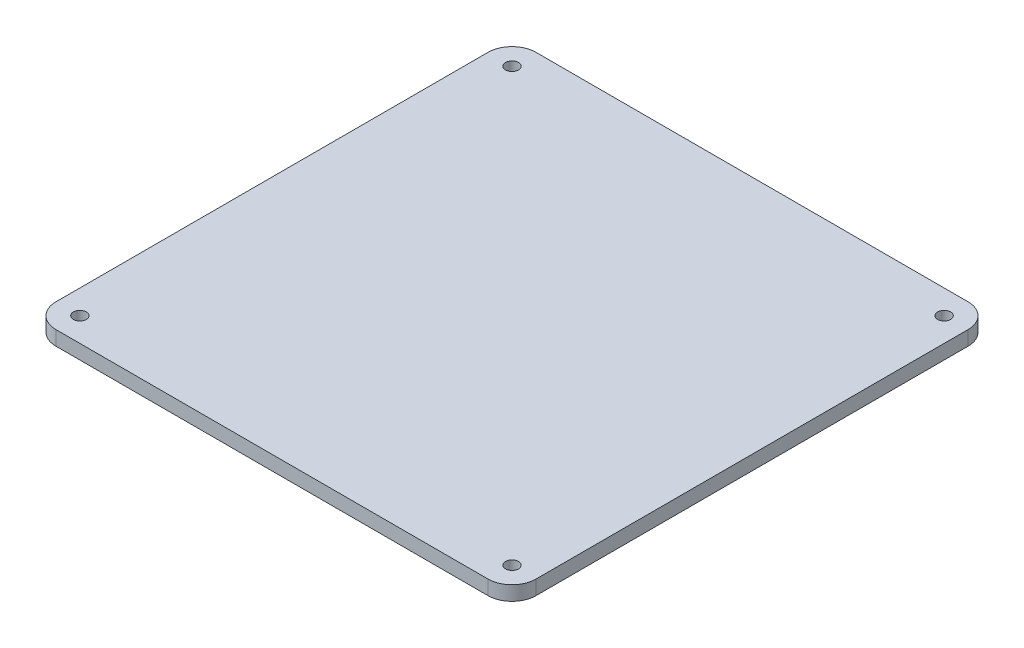
ISO-10303-21;
HEADER;
FILE_DESCRIPTION(('STEP AP214'),'2;1');
FILE_NAME('part.step','',(''),(''),'','','');
FILE_SCHEMA(('AUTOMOTIVE_DESIGN { 1 0 10303 214 1 1 1 1 }'));
ENDSEC;
DATA;
#1=APPLICATION_CONTEXT('core data for automotive mechanical design processes');
#2=APPLICATION_PROTOCOL_DEFINITION('international standard','automotive_design',2000,#1);
#3=PRODUCT_CONTEXT('',#1,'mechanical');
#4=PRODUCT('Part','Part','',(#3));
#5=PRODUCT_RELATED_PRODUCT_CATEGORY('part','',(#4));
#6=PRODUCT_DEFINITION_FORMATION('','',#4);
#7=PRODUCT_DEFINITION_CONTEXT('part definition',#1,'design');
#8=PRODUCT_DEFINITION('design','',#6,#7);
#9=PRODUCT_DEFINITION_SHAPE('','',#8);
#10=(LENGTH_UNIT() NAMED_UNIT(*) SI_UNIT(.MILLI.,.METRE.));
#11=(NAMED_UNIT(*) PLANE_ANGLE_UNIT() SI_UNIT($,.RADIAN.));
#12=(NAMED_UNIT(*) SI_UNIT($,.STERADIAN.) SOLID_ANGLE_UNIT());
#13=UNCERTAINTY_MEASURE_WITH_UNIT(LENGTH_MEASURE(1.E-05),#10,'distance_accuracy_value','');
#14=(GEOMETRIC_REPRESENTATION_CONTEXT(3) GLOBAL_UNCERTAINTY_ASSIGNED_CONTEXT((#13)) GLOBAL_UNIT_ASSIGNED_CONTEXT((#10,
#11,#12)) REPRESENTATION_CONTEXT('',''));
#15=CARTESIAN_POINT('',(0.,0.,0.));
#16=DIRECTION('',(0.,0.,1.));
#17=DIRECTION('',(1.,0.,0.));
#18=AXIS2_PLACEMENT_3D('',#15,#16,#17);
#19=CARTESIAN_POINT('',(100.,6.,100.));
#20=DIRECTION('',(-1.,0.,0.));
#21=DIRECTION('',(0.,0.,1.));
#22=AXIS2_PLACEMENT_3D('',#19,#20,#21);
#23=PLANE('',#22);
#24=DIRECTION('',(0.,0.,-1.));
#25=VECTOR('',#24,1.);
#26=CARTESIAN_POINT('',(100.,0.,100.));
#27=LINE('',#26,#25);
#28=CARTESIAN_POINT('',(100.,0.,90.));
#29=VERTEX_POINT('',#28);
#30=CARTESIAN_POINT('',(100.,0.,-90.));
#31=VERTEX_POINT('',#30);
#32=EDGE_CURVE('E161',#29,#31,#27,.T.);
#33=ORIENTED_EDGE('',*,*,#32,.T.);
#34=DIRECTION('',(0.,-1.,0.));
#35=VECTOR('',#34,1.);
#36=CARTESIAN_POINT('',(100.,6.,-90.));
#37=LINE('',#36,#35);
#38=CARTESIAN_POINT('',(100.,6.,-90.));
#39=VERTEX_POINT('',#38);
#40=EDGE_CURVE('E11',#31,#39,#37,.F.);
#41=ORIENTED_EDGE('',*,*,#40,.T.);
#42=DIRECTION('',(0.,0.,-1.));
#43=VECTOR('',#42,1.);
#44=CARTESIAN_POINT('',(100.,6.,100.));
#45=LINE('',#44,#43);
#46=CARTESIAN_POINT('',(100.,6.,90.));
#47=VERTEX_POINT('',#46);
#48=EDGE_CURVE('E129',#47,#39,#45,.T.);
#49=ORIENTED_EDGE('',*,*,#48,.F.);
#50=DIRECTION('',(0.,-1.,0.));
#51=VECTOR('',#50,1.);
#52=CARTESIAN_POINT('',(100.,6.,90.));
#53=LINE('',#52,#51);
#54=EDGE_CURVE('E45',#47,#29,#53,.T.);
#55=ORIENTED_EDGE('',*,*,#54,.T.);
#56=EDGE_LOOP('',(#33,#41,#49,#55));
#57=FACE_BOUND('',#56,.T.);
#58=ADVANCED_FACE('F37',(#57),#23,.F.);
#59=CARTESIAN_POINT('',(-100.,6.,-100.));
#60=DIRECTION('',(0.,0.,1.));
#61=DIRECTION('',(1.,0.,0.));
#62=AXIS2_PLACEMENT_3D('',#59,#60,#61);
#63=PLANE('',#62);
#64=DIRECTION('',(-1.,0.,0.));
#65=VECTOR('',#64,1.);
#66=CARTESIAN_POINT('',(-100.,0.,-100.));
#67=LINE('',#66,#65);
#68=CARTESIAN_POINT('',(90.,0.,-100.));
#69=VERTEX_POINT('',#68);
#70=CARTESIAN_POINT('',(-90.0000000000001,0.,-100.));
#71=VERTEX_POINT('',#70);
#72=EDGE_CURVE('E134',#69,#71,#67,.T.);
#73=ORIENTED_EDGE('',*,*,#72,.T.);
#74=DIRECTION('',(0.,-1.,0.));
#75=VECTOR('',#74,1.);
#76=CARTESIAN_POINT('',(-90.0000000000001,6.,-100.));
#77=LINE('',#76,#75);
#78=CARTESIAN_POINT('',(-90.0000000000001,6.,-100.));
#79=VERTEX_POINT('',#78);
#80=EDGE_CURVE('E52',#71,#79,#77,.F.);
#81=ORIENTED_EDGE('',*,*,#80,.T.);
#82=DIRECTION('',(-1.,0.,0.));
#83=VECTOR('',#82,1.);
#84=CARTESIAN_POINT('',(-100.,6.,-100.));
#85=LINE('',#84,#83);
#86=CARTESIAN_POINT('',(90.,6.,-100.));
#87=VERTEX_POINT('',#86);
#88=EDGE_CURVE('E132',#87,#79,#85,.T.);
#89=ORIENTED_EDGE('',*,*,#88,.F.);
#90=DIRECTION('',(0.,-1.,0.));
#91=VECTOR('',#90,1.);
#92=CARTESIAN_POINT('',(90.,6.,-100.));
#93=LINE('',#92,#91);
#94=EDGE_CURVE('E153',#87,#69,#93,.T.);
#95=ORIENTED_EDGE('',*,*,#94,.T.);
#96=EDGE_LOOP('',(#73,#81,#89,#95));
#97=FACE_BOUND('',#96,.T.);
#98=ADVANCED_FACE('F216',(#97),#63,.F.);
#99=CARTESIAN_POINT('',(-100.,6.,100.));
#100=DIRECTION('',(1.,0.,0.));
#101=DIRECTION('',(0.,0.,-1.));
#102=AXIS2_PLACEMENT_3D('',#99,#100,#101);
#103=PLANE('',#102);
#104=DIRECTION('',(0.,0.,1.));
#105=VECTOR('',#104,1.);
#106=CARTESIAN_POINT('',(-100.,0.,100.));
#107=LINE('',#106,#105);
#108=CARTESIAN_POINT('',(-100.,0.,-90.));
#109=VERTEX_POINT('',#108);
#110=CARTESIAN_POINT('',(-100.,0.,90.));
#111=VERTEX_POINT('',#110);
#112=EDGE_CURVE('E130',#109,#111,#107,.T.);
#113=ORIENTED_EDGE('',*,*,#112,.T.);
#114=DIRECTION('',(0.,-1.,0.));
#115=VECTOR('',#114,1.);
#116=CARTESIAN_POINT('',(-100.,6.,90.));
#117=LINE('',#116,#115);
#118=CARTESIAN_POINT('',(-100.,6.,90.));
#119=VERTEX_POINT('',#118);
#120=EDGE_CURVE('E108',#111,#119,#117,.F.);
#121=ORIENTED_EDGE('',*,*,#120,.T.);
#122=DIRECTION('',(0.,0.,1.));
#123=VECTOR('',#122,1.);
#124=CARTESIAN_POINT('',(-100.,6.,100.));
#125=LINE('',#124,#123);
#126=CARTESIAN_POINT('',(-100.,6.,-90.));
#127=VERTEX_POINT('',#126);
#128=EDGE_CURVE('E173',#127,#119,#125,.T.);
#129=ORIENTED_EDGE('',*,*,#128,.F.);
#130=DIRECTION('',(0.,-1.,0.));
#131=VECTOR('',#130,1.);
#132=CARTESIAN_POINT('',(-100.,6.,-90.));
#133=LINE('',#132,#131);
#134=EDGE_CURVE('E113',#127,#109,#133,.T.);
#135=ORIENTED_EDGE('',*,*,#134,.T.);
#136=EDGE_LOOP('',(#113,#121,#129,#135));
#137=FACE_BOUND('',#136,.T.);
#138=ADVANCED_FACE('F213',(#137),#103,.F.);
#139=CARTESIAN_POINT('',(-100.,6.,100.));
#140=DIRECTION('',(0.,0.,-1.));
#141=DIRECTION('',(-1.,0.,0.));
#142=AXIS2_PLACEMENT_3D('',#139,#140,#141);
#143=PLANE('',#142);
#144=DIRECTION('',(1.,0.,0.));
#145=VECTOR('',#144,1.);
#146=CARTESIAN_POINT('',(-100.,6.,100.));
#147=LINE('',#146,#145);
#148=CARTESIAN_POINT('',(-90.0000000000001,6.,100.));
#149=VERTEX_POINT('',#148);
#150=CARTESIAN_POINT('',(90.,6.,100.));
#151=VERTEX_POINT('',#150);
#152=EDGE_CURVE('E123',#149,#151,#147,.T.);
#153=ORIENTED_EDGE('',*,*,#152,.F.);
#154=DIRECTION('',(0.,-1.,0.));
#155=VECTOR('',#154,1.);
#156=CARTESIAN_POINT('',(-90.0000000000001,6.,100.));
#157=LINE('',#156,#155);
#158=CARTESIAN_POINT('',(-90.0000000000001,0.,100.));
#159=VERTEX_POINT('',#158);
#160=EDGE_CURVE('E107',#149,#159,#157,.T.);
#161=ORIENTED_EDGE('',*,*,#160,.T.);
#162=DIRECTION('',(1.,0.,0.));
#163=VECTOR('',#162,1.);
#164=CARTESIAN_POINT('',(-100.,0.,100.));
#165=LINE('',#164,#163);
#166=CARTESIAN_POINT('',(90.,0.,100.));
#167=VERTEX_POINT('',#166);
#168=EDGE_CURVE('E120',#159,#167,#165,.T.);
#169=ORIENTED_EDGE('',*,*,#168,.T.);
#170=DIRECTION('',(0.,-1.,0.));
#171=VECTOR('',#170,1.);
#172=CARTESIAN_POINT('',(90.,6.,100.));
#173=LINE('',#172,#171);
#174=EDGE_CURVE('E125',#167,#151,#173,.F.);
#175=ORIENTED_EDGE('',*,*,#174,.T.);
#176=EDGE_LOOP('',(#153,#161,#169,#175));
#177=FACE_BOUND('',#176,.T.);
#178=ADVANCED_FACE('F119',(#177),#143,.F.);
#179=CARTESIAN_POINT('',(0.,6.,0.));
#180=DIRECTION('',(0.,-1.,0.));
#181=DIRECTION('',(0.,0.,-1.));
#182=AXIS2_PLACEMENT_3D('',#179,#180,#181);
#183=PLANE('',#182);
#184=CARTESIAN_POINT('',(-90.0000000000001,6.,-90.));
#185=DIRECTION('',(0.,1.,0.));
#186=DIRECTION('',(0.,0.,1.));
#187=AXIS2_PLACEMENT_3D('',#184,#185,#186);
#188=CIRCLE('',#187,2.70509999999999);
#189=CARTESIAN_POINT('',(-90.0000000000001,6.,-87.2949));
#190=VERTEX_POINT('',#189);
#191=EDGE_CURVE('E194',#190,#190,#188,.T.);
#192=ORIENTED_EDGE('',*,*,#191,.F.);
#193=EDGE_LOOP('',(#192));
#194=FACE_BOUND('',#193,.T.);
#195=CARTESIAN_POINT('',(90.,6.,-90.));
#196=DIRECTION('',(0.,1.,0.));
#197=DIRECTION('',(0.,0.,1.));
#198=AXIS2_PLACEMENT_3D('',#195,#196,#197);
#199=CIRCLE('',#198,2.70509999999999);
#200=CARTESIAN_POINT('',(90.,6.,-87.2949));
#201=VERTEX_POINT('',#200);
#202=EDGE_CURVE('E188',#201,#201,#199,.T.);
#203=ORIENTED_EDGE('',*,*,#202,.F.);
#204=EDGE_LOOP('',(#203));
#205=FACE_BOUND('',#204,.T.);
#206=CARTESIAN_POINT('',(90.,6.,90.));
#207=DIRECTION('',(0.,1.,0.));
#208=DIRECTION('',(0.,0.,1.));
#209=AXIS2_PLACEMENT_3D('',#206,#207,#208);
#210=CIRCLE('',#209,2.70509999999999);
#211=CARTESIAN_POINT('',(90.,6.,92.7051));
#212=VERTEX_POINT('',#211);
#213=EDGE_CURVE('E182',#212,#212,#210,.T.);
#214=ORIENTED_EDGE('',*,*,#213,.F.);
#215=EDGE_LOOP('',(#214));
#216=FACE_BOUND('',#215,.T.);
#217=CARTESIAN_POINT('',(-90.0000000000001,6.,90.));
#218=DIRECTION('',(0.,1.,0.));
#219=DIRECTION('',(0.,0.,1.));
#220=AXIS2_PLACEMENT_3D('',#217,#218,#219);
#221=CIRCLE('',#220,2.70509999999999);
#222=CARTESIAN_POINT('',(-90.0000000000001,6.,92.7051));
#223=VERTEX_POINT('',#222);
#224=EDGE_CURVE('E169',#223,#223,#221,.T.);
#225=ORIENTED_EDGE('',*,*,#224,.F.);
#226=EDGE_LOOP('',(#225));
#227=FACE_BOUND('',#226,.T.);
#228=ORIENTED_EDGE('',*,*,#128,.T.);
#229=CARTESIAN_POINT('',(-90.0000000000001,6.,90.));
#230=DIRECTION('',(0.,-1.,0.));
#231=DIRECTION('',(0.,0.,-1.));
#232=AXIS2_PLACEMENT_3D('',#229,#230,#231);
#233=CIRCLE('',#232,10.);
#234=EDGE_CURVE('E151',#119,#149,#233,.F.);
#235=ORIENTED_EDGE('',*,*,#234,.T.);
#236=ORIENTED_EDGE('',*,*,#152,.T.);
#237=CARTESIAN_POINT('',(90.,6.,90.));
#238=DIRECTION('',(0.,-1.,0.));
#239=DIRECTION('',(0.,0.,-1.));
#240=AXIS2_PLACEMENT_3D('',#237,#238,#239);
#241=CIRCLE('',#240,10.);
#242=EDGE_CURVE('E146',#151,#47,#241,.F.);
#243=ORIENTED_EDGE('',*,*,#242,.T.);
#244=ORIENTED_EDGE('',*,*,#48,.T.);
#245=CARTESIAN_POINT('',(90.,6.,-90.));
#246=DIRECTION('',(0.,-1.,0.));
#247=DIRECTION('',(0.,0.,-1.));
#248=AXIS2_PLACEMENT_3D('',#245,#246,#247);
#249=CIRCLE('',#248,10.);
#250=EDGE_CURVE('E59',#39,#87,#249,.F.);
#251=ORIENTED_EDGE('',*,*,#250,.T.);
#252=ORIENTED_EDGE('',*,*,#88,.T.);
#253=CARTESIAN_POINT('',(-90.0000000000001,6.,-90.));
#254=DIRECTION('',(0.,-1.,0.));
#255=DIRECTION('',(0.,0.,-1.));
#256=AXIS2_PLACEMENT_3D('',#253,#254,#255);
#257=CIRCLE('',#256,10.);
#258=EDGE_CURVE('E149',#79,#127,#257,.F.);
#259=ORIENTED_EDGE('',*,*,#258,.T.);
#260=EDGE_LOOP('',(#228,#235,#236,#243,#244,#251,#252,#259));
#261=FACE_BOUND('',#260,.T.);
#262=ADVANCED_FACE('F200',(#194,#205,#216,#227,#261),#183,.F.);
#263=CARTESIAN_POINT('',(0.,0.,0.));
#264=DIRECTION('',(0.,-1.,0.));
#265=DIRECTION('',(0.,0.,-1.));
#266=AXIS2_PLACEMENT_3D('',#263,#264,#265);
#267=PLANE('',#266);
#268=CARTESIAN_POINT('',(-90.0000000000001,0.,-90.));
#269=DIRECTION('',(0.,1.,0.));
#270=DIRECTION('',(0.,0.,1.));
#271=AXIS2_PLACEMENT_3D('',#268,#269,#270);
#272=CIRCLE('',#271,2.70509999999999);
#273=CARTESIAN_POINT('',(-90.0000000000001,0.,-87.2949));
#274=VERTEX_POINT('',#273);
#275=EDGE_CURVE('E191',#274,#274,#272,.T.);
#276=ORIENTED_EDGE('',*,*,#275,.T.);
#277=EDGE_LOOP('',(#276));
#278=FACE_BOUND('',#277,.T.);
#279=CARTESIAN_POINT('',(90.,0.,-90.));
#280=DIRECTION('',(0.,1.,0.));
#281=DIRECTION('',(0.,0.,1.));
#282=AXIS2_PLACEMENT_3D('',#279,#280,#281);
#283=CIRCLE('',#282,2.70509999999999);
#284=CARTESIAN_POINT('',(90.,0.,-87.2949));
#285=VERTEX_POINT('',#284);
#286=EDGE_CURVE('E185',#285,#285,#283,.T.);
#287=ORIENTED_EDGE('',*,*,#286,.T.);
#288=EDGE_LOOP('',(#287));
#289=FACE_BOUND('',#288,.T.);
#290=CARTESIAN_POINT('',(90.,0.,90.));
#291=DIRECTION('',(0.,1.,0.));
#292=DIRECTION('',(0.,0.,1.));
#293=AXIS2_PLACEMENT_3D('',#290,#291,#292);
#294=CIRCLE('',#293,2.70509999999999);
#295=CARTESIAN_POINT('',(90.,0.,92.7051));
#296=VERTEX_POINT('',#295);
#297=EDGE_CURVE('E179',#296,#296,#294,.T.);
#298=ORIENTED_EDGE('',*,*,#297,.T.);
#299=EDGE_LOOP('',(#298));
#300=FACE_BOUND('',#299,.T.);
#301=CARTESIAN_POINT('',(-90.0000000000001,0.,90.));
#302=DIRECTION('',(0.,1.,0.));
#303=DIRECTION('',(0.,0.,1.));
#304=AXIS2_PLACEMENT_3D('',#301,#302,#303);
#305=CIRCLE('',#304,2.70509999999999);
#306=CARTESIAN_POINT('',(-90.0000000000001,0.,92.7051));
#307=VERTEX_POINT('',#306);
#308=EDGE_CURVE('E166',#307,#307,#305,.T.);
#309=ORIENTED_EDGE('',*,*,#308,.T.);
#310=EDGE_LOOP('',(#309));
#311=FACE_BOUND('',#310,.T.);
#312=ORIENTED_EDGE('',*,*,#168,.F.);
#313=CARTESIAN_POINT('',(-90.0000000000001,0.,90.));
#314=DIRECTION('',(0.,-1.,0.));
#315=DIRECTION('',(0.,0.,-1.));
#316=AXIS2_PLACEMENT_3D('',#313,#314,#315);
#317=CIRCLE('',#316,10.);
#318=EDGE_CURVE('E103',#159,#111,#317,.T.);
#319=ORIENTED_EDGE('',*,*,#318,.T.);
#320=ORIENTED_EDGE('',*,*,#112,.F.);
#321=CARTESIAN_POINT('',(-90.0000000000001,0.,-90.));
#322=DIRECTION('',(0.,-1.,0.));
#323=DIRECTION('',(0.,0.,-1.));
#324=AXIS2_PLACEMENT_3D('',#321,#322,#323);
#325=CIRCLE('',#324,10.);
#326=EDGE_CURVE('E114',#109,#71,#325,.T.);
#327=ORIENTED_EDGE('',*,*,#326,.T.);
#328=ORIENTED_EDGE('',*,*,#72,.F.);
#329=CARTESIAN_POINT('',(90.,0.,-90.));
#330=DIRECTION('',(0.,-1.,0.));
#331=DIRECTION('',(0.,0.,-1.));
#332=AXIS2_PLACEMENT_3D('',#329,#330,#331);
#333=CIRCLE('',#332,10.);
#334=EDGE_CURVE('E140',#69,#31,#333,.T.);
#335=ORIENTED_EDGE('',*,*,#334,.T.);
#336=ORIENTED_EDGE('',*,*,#32,.F.);
#337=CARTESIAN_POINT('',(90.,0.,90.));
#338=DIRECTION('',(0.,-1.,0.));
#339=DIRECTION('',(0.,0.,-1.));
#340=AXIS2_PLACEMENT_3D('',#337,#338,#339);
#341=CIRCLE('',#340,10.);
#342=EDGE_CURVE('E124',#29,#167,#341,.T.);
#343=ORIENTED_EDGE('',*,*,#342,.T.);
#344=EDGE_LOOP('',(#312,#319,#320,#327,#328,#335,#336,#343));
#345=FACE_BOUND('',#344,.T.);
#346=ADVANCED_FACE('F127',(#278,#289,#300,#311,#345),#267,.T.);
#347=CARTESIAN_POINT('',(-90.0000000000001,6.,90.));
#348=DIRECTION('',(0.,-1.,0.));
#349=DIRECTION('',(0.,0.,-1.));
#350=AXIS2_PLACEMENT_3D('',#347,#348,#349);
#351=CYLINDRICAL_SURFACE('',#350,10.);
#352=ORIENTED_EDGE('',*,*,#234,.F.);
#353=ORIENTED_EDGE('',*,*,#120,.F.);
#354=ORIENTED_EDGE('',*,*,#318,.F.);
#355=ORIENTED_EDGE('',*,*,#160,.F.);
#356=EDGE_LOOP('',(#352,#353,#354,#355));
#357=FACE_BOUND('',#356,.T.);
#358=ADVANCED_FACE('F106',(#357),#351,.T.);
#359=CARTESIAN_POINT('',(-90.0000000000001,6.,-90.));
#360=DIRECTION('',(0.,-1.,0.));
#361=DIRECTION('',(0.,0.,-1.));
#362=AXIS2_PLACEMENT_3D('',#359,#360,#361);
#363=CYLINDRICAL_SURFACE('',#362,10.);
#364=ORIENTED_EDGE('',*,*,#258,.F.);
#365=ORIENTED_EDGE('',*,*,#80,.F.);
#366=ORIENTED_EDGE('',*,*,#326,.F.);
#367=ORIENTED_EDGE('',*,*,#134,.F.);
#368=EDGE_LOOP('',(#364,#365,#366,#367));
#369=FACE_BOUND('',#368,.T.);
#370=ADVANCED_FACE('F215',(#369),#363,.T.);
#371=CARTESIAN_POINT('',(90.,6.,-90.));
#372=DIRECTION('',(0.,-1.,0.));
#373=DIRECTION('',(0.,0.,-1.));
#374=AXIS2_PLACEMENT_3D('',#371,#372,#373);
#375=CYLINDRICAL_SURFACE('',#374,10.);
#376=ORIENTED_EDGE('',*,*,#250,.F.);
#377=ORIENTED_EDGE('',*,*,#40,.F.);
#378=ORIENTED_EDGE('',*,*,#334,.F.);
#379=ORIENTED_EDGE('',*,*,#94,.F.);
#380=EDGE_LOOP('',(#376,#377,#378,#379));
#381=FACE_BOUND('',#380,.T.);
#382=ADVANCED_FACE('F219',(#381),#375,.T.);
#383=CARTESIAN_POINT('',(90.,6.,90.));
#384=DIRECTION('',(0.,-1.,0.));
#385=DIRECTION('',(0.,0.,-1.));
#386=AXIS2_PLACEMENT_3D('',#383,#384,#385);
#387=CYLINDRICAL_SURFACE('',#386,10.);
#388=ORIENTED_EDGE('',*,*,#242,.F.);
#389=ORIENTED_EDGE('',*,*,#174,.F.);
#390=ORIENTED_EDGE('',*,*,#342,.F.);
#391=ORIENTED_EDGE('',*,*,#54,.F.);
#392=EDGE_LOOP('',(#388,#389,#390,#391));
#393=FACE_BOUND('',#392,.T.);
#394=ADVANCED_FACE('F39',(#393),#387,.T.);
#395=CARTESIAN_POINT('',(-90.0000000000001,6.,90.));
#396=DIRECTION('',(0.,1.,0.));
#397=DIRECTION('',(0.,0.,1.));
#398=AXIS2_PLACEMENT_3D('',#395,#396,#397);
#399=CYLINDRICAL_SURFACE('',#398,2.70509999999999);
#400=ORIENTED_EDGE('',*,*,#308,.F.);
#401=EDGE_LOOP('',(#400));
#402=FACE_BOUND('',#401,.T.);
#403=ORIENTED_EDGE('',*,*,#224,.T.);
#404=EDGE_LOOP('',(#403));
#405=FACE_BOUND('',#404,.T.);
#406=ADVANCED_FACE('F221',(#402,#405),#399,.F.);
#407=CARTESIAN_POINT('',(90.,6.,90.));
#408=DIRECTION('',(0.,1.,0.));
#409=DIRECTION('',(0.,0.,1.));
#410=AXIS2_PLACEMENT_3D('',#407,#408,#409);
#411=CYLINDRICAL_SURFACE('',#410,2.70509999999999);
#412=ORIENTED_EDGE('',*,*,#297,.F.);
#413=EDGE_LOOP('',(#412));
#414=FACE_BOUND('',#413,.T.);
#415=ORIENTED_EDGE('',*,*,#213,.T.);
#416=EDGE_LOOP('',(#415));
#417=FACE_BOUND('',#416,.T.);
#418=ADVANCED_FACE('F226',(#414,#417),#411,.F.);
#419=CARTESIAN_POINT('',(90.,6.,-90.));
#420=DIRECTION('',(0.,1.,0.));
#421=DIRECTION('',(0.,0.,1.));
#422=AXIS2_PLACEMENT_3D('',#419,#420,#421);
#423=CYLINDRICAL_SURFACE('',#422,2.70509999999999);
#424=ORIENTED_EDGE('',*,*,#286,.F.);
#425=EDGE_LOOP('',(#424));
#426=FACE_BOUND('',#425,.T.);
#427=ORIENTED_EDGE('',*,*,#202,.T.);
#428=EDGE_LOOP('',(#427));
#429=FACE_BOUND('',#428,.T.);
#430=ADVANCED_FACE('F282',(#426,#429),#423,.F.);
#431=CARTESIAN_POINT('',(-90.0000000000001,6.,-90.));
#432=DIRECTION('',(0.,1.,0.));
#433=DIRECTION('',(0.,0.,1.));
#434=AXIS2_PLACEMENT_3D('',#431,#432,#433);
#435=CYLINDRICAL_SURFACE('',#434,2.70509999999999);
#436=ORIENTED_EDGE('',*,*,#275,.F.);
#437=EDGE_LOOP('',(#436));
#438=FACE_BOUND('',#437,.T.);
#439=ORIENTED_EDGE('',*,*,#191,.T.);
#440=EDGE_LOOP('',(#439));
#441=FACE_BOUND('',#440,.T.);
#442=ADVANCED_FACE('F198',(#438,#441),#435,.F.);
#443=CLOSED_SHELL('',(#58,#98,#138,#178,#262,#346,#358,#370,#382,#394,#406,#418,#430,#442));
#444=MANIFOLD_SOLID_BREP('B2',#443);
#445=ADVANCED_BREP_SHAPE_REPRESENTATION('',(#18,#444),#14);
#446=SHAPE_DEFINITION_REPRESENTATION(#9,#445);
ENDSEC;
END-ISO-10303-21;
